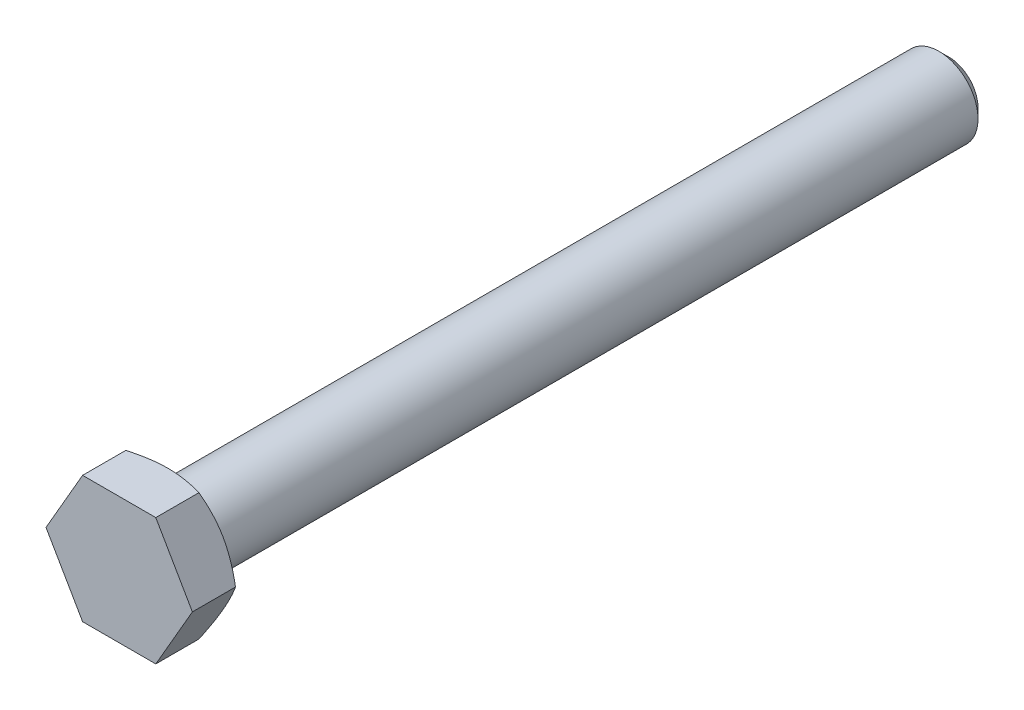
ISO-10303-21;
HEADER;
FILE_DESCRIPTION(('STEP AP214'),'2;1');
FILE_NAME('part.step','',(''),(''),'','','');
FILE_SCHEMA(('AUTOMOTIVE_DESIGN { 1 0 10303 214 1 1 1 1 }'));
ENDSEC;
DATA;
#1=APPLICATION_CONTEXT('core data for automotive mechanical design processes');
#2=APPLICATION_PROTOCOL_DEFINITION('international standard','automotive_design',2000,#1);
#3=PRODUCT_CONTEXT('',#1,'mechanical');
#4=PRODUCT('Part','Part','',(#3));
#5=PRODUCT_RELATED_PRODUCT_CATEGORY('part','',(#4));
#6=PRODUCT_DEFINITION_FORMATION('','',#4);
#7=PRODUCT_DEFINITION_CONTEXT('part definition',#1,'design');
#8=PRODUCT_DEFINITION('design','',#6,#7);
#9=PRODUCT_DEFINITION_SHAPE('','',#8);
#10=(LENGTH_UNIT() NAMED_UNIT(*) SI_UNIT(.MILLI.,.METRE.));
#11=(NAMED_UNIT(*) PLANE_ANGLE_UNIT() SI_UNIT($,.RADIAN.));
#12=(NAMED_UNIT(*) SI_UNIT($,.STERADIAN.) SOLID_ANGLE_UNIT());
#13=UNCERTAINTY_MEASURE_WITH_UNIT(LENGTH_MEASURE(1.E-05),#10,'distance_accuracy_value','');
#14=(GEOMETRIC_REPRESENTATION_CONTEXT(3) GLOBAL_UNCERTAINTY_ASSIGNED_CONTEXT((#13)) GLOBAL_UNIT_ASSIGNED_CONTEXT((#10,
#11,#12)) REPRESENTATION_CONTEXT('',''));
#15=CARTESIAN_POINT('',(0.,0.,0.));
#16=DIRECTION('',(0.,0.,1.));
#17=DIRECTION('',(1.,0.,0.));
#18=AXIS2_PLACEMENT_3D('',#15,#16,#17);
#19=CARTESIAN_POINT('',(7.5,0.,5.));
#20=DIRECTION('',(-0.866025403784439,-0.5,0.));
#21=DIRECTION('',(0.5,-0.866025403784439,0.));
#22=AXIS2_PLACEMENT_3D('',#19,#20,#21);
#23=PLANE('',#22);
#24=DIRECTION('',(0.,0.,-1.));
#25=VECTOR('',#24,1.);
#26=CARTESIAN_POINT('',(7.5,0.,5.));
#27=LINE('',#26,#25);
#28=CARTESIAN_POINT('',(7.5,0.,5.));
#29=VERTEX_POINT('',#28);
#30=CARTESIAN_POINT('',(7.5,0.,0.580127018922191));
#31=VERTEX_POINT('',#30);
#32=EDGE_CURVE('E143',#29,#31,#27,.T.);
#33=ORIENTED_EDGE('',*,*,#32,.T.);
#34=CARTESIAN_POINT('',(7.50011547005384,-0.000199999999999949,0.580193687128435));
#35=CARTESIAN_POINT('',(7.41768616603124,0.142571742599681,0.532610090419495));
#36=CARTESIAN_POINT('',(7.3349495256106,0.285875807455784,0.487186000875851));
#37=CARTESIAN_POINT('',(7.16880433369847,0.573647721280876,0.401251609567944));
#38=CARTESIAN_POINT('',(7.08539550877554,0.718116043847015,0.360743427545913));
#39=CARTESIAN_POINT('',(6.83383355035314,1.15383413708613,0.247387850758794));
#40=CARTESIAN_POINT('',(6.66468741472466,1.44680383789861,0.182912394052971));
#41=CARTESIAN_POINT('',(6.4115632992282,1.8852276665594,0.107307146727918));
#42=CARTESIAN_POINT('',(6.32834163062897,2.02937182486393,0.0857693653869544));
#43=CARTESIAN_POINT('',(6.16152225564995,2.31831145801448,0.0496535615876752));
#44=CARTESIAN_POINT('',(6.07792458315417,2.46310687417167,0.0350749241985891));
#45=CARTESIAN_POINT('',(5.91058404423487,2.75294918974585,0.0132489492577837));
#46=CARTESIAN_POINT('',(5.82684145112455,2.89799561577049,0.00599329148663797));
#47=CARTESIAN_POINT('',(5.65928352773976,3.18821445228368,-0.00103892731730185));
#48=CARTESIAN_POINT('',(5.57546819979228,3.33338685874177,-0.000815719394339566));
#49=CARTESIAN_POINT('',(5.34584085633415,3.73111308441831,0.0100759915864038));
#50=CARTESIAN_POINT('',(5.20010400598298,3.9835367137616,0.0283608108200575));
#51=CARTESIAN_POINT('',(4.90959827845889,4.4867073937231,0.0863424032005451));
#52=CARTESIAN_POINT('',(4.76483042296501,4.73745267474128,0.126058994528075));
#53=CARTESIAN_POINT('',(4.47374004278017,5.24163600281596,0.225339055162585));
#54=CARTESIAN_POINT('',(4.3274542486132,5.49501043073871,0.285323167972338));
#55=CARTESIAN_POINT('',(4.03706420721455,5.99798073645321,0.421462943609341));
#56=CARTESIAN_POINT('',(3.89295624098379,6.24758305574031,0.49758662732135));
#57=CARTESIAN_POINT('',(3.74988452994616,6.49539052838329,0.580193687128433));
#58=B_SPLINE_CURVE_WITH_KNOTS('',3,(#34,#35,#36,#37,#38,#39,#40,#41,#42,#43,#44,#45,#46,#47,#48,
#49,#50,#51,#52,#53,#54,#55,#56,#57),.UNSPECIFIED.,.F.,.F.,(4,2,2,2,2,2,2,2,2,2,2,4),(0.,
0.514723922375489,1.02966901127207,2.0616989527718,2.5650745724735,3.06840570416265,
3.57116431536224,4.07390739487819,4.9491290028208,5.82516132758661,6.72062300407034,
7.61432671345324),.UNSPECIFIED.);
#59=CARTESIAN_POINT('',(5.625,3.24759526419165,0.));
#60=VERTEX_POINT('',#59);
#61=EDGE_CURVE('E63',#31,#60,#58,.T.);
#62=ORIENTED_EDGE('',*,*,#61,.T.);
#63=CARTESIAN_POINT('',(3.75,6.49519052838329,0.58012701892219));
#64=VERTEX_POINT('',#63);
#65=EDGE_CURVE('E113',#60,#64,#58,.T.);
#66=ORIENTED_EDGE('',*,*,#65,.T.);
#67=DIRECTION('',(0.,0.,-1.));
#68=VECTOR('',#67,1.);
#69=CARTESIAN_POINT('',(3.75,6.49519052838329,5.));
#70=LINE('',#69,#68);
#71=CARTESIAN_POINT('',(3.75,6.49519052838329,5.));
#72=VERTEX_POINT('',#71);
#73=EDGE_CURVE('E133',#72,#64,#70,.T.);
#74=ORIENTED_EDGE('',*,*,#73,.F.);
#75=DIRECTION('',(-0.5,0.866025403784438,0.));
#76=VECTOR('',#75,1.);
#77=CARTESIAN_POINT('',(7.5,0.,5.));
#78=LINE('',#77,#76);
#79=EDGE_CURVE('E145',#29,#72,#78,.T.);
#80=ORIENTED_EDGE('',*,*,#79,.F.);
#81=EDGE_LOOP('',(#33,#62,#66,#74,#80));
#82=FACE_BOUND('',#81,.T.);
#83=ADVANCED_FACE('F40',(#82),#23,.F.);
#84=CARTESIAN_POINT('',(3.75,6.49519052838329,5.));
#85=DIRECTION('',(0.,-1.,0.));
#86=DIRECTION('',(1.,0.,0.));
#87=AXIS2_PLACEMENT_3D('',#84,#85,#86);
#88=PLANE('',#87);
#89=ORIENTED_EDGE('',*,*,#73,.T.);
#90=CARTESIAN_POINT('',(-10.2143177328781,6.49519052838329,3.23855699812648));
#91=CARTESIAN_POINT('',(-9.92937782566756,6.49519052838329,3.09977310338341));
#92=CARTESIAN_POINT('',(-9.64379873250614,6.49519052838329,2.96227977722785));
#93=CARTESIAN_POINT('',(-9.07102271991364,6.49519052838329,2.690597498021));
#94=CARTESIAN_POINT('',(-8.78382556611934,6.49519052838329,2.55640903960392));
#95=CARTESIAN_POINT('',(-8.20606136902504,6.49519052838329,2.29141476420042));
#96=CARTESIAN_POINT('',(-7.91548456955182,6.49519052838329,2.1606301474799));
#97=CARTESIAN_POINT('',(-7.3320683315702,6.49519052838329,1.90422854126504));
#98=CARTESIAN_POINT('',(-7.03922899676572,6.49519052838329,1.77861131657145));
#99=CARTESIAN_POINT('',(-6.44091658138017,6.49519052838329,1.52978473547082));
#100=CARTESIAN_POINT('',(-6.13535008160523,6.49519052838329,1.40679882379654));
#101=CARTESIAN_POINT('',(-5.52069463815076,6.49519052838329,1.1697974683184));
#102=CARTESIAN_POINT('',(-5.21160531141305,6.49519052838329,1.05578301089667));
#103=CARTESIAN_POINT('',(-4.58994750100513,6.49519052838329,0.839613687055503));
#104=CARTESIAN_POINT('',(-4.2773870280813,6.49519052838329,0.737436003614696));
#105=CARTESIAN_POINT('',(-3.64778139182068,6.49519052838329,0.548125910576095));
#106=CARTESIAN_POINT('',(-3.33073762878825,6.49519052838329,0.460988910786462));
#107=CARTESIAN_POINT('',(-2.69375106173017,6.49519052838329,0.306305297362037));
#108=CARTESIAN_POINT('',(-2.37383516188108,6.49519052838329,0.23864962450138));
#109=CARTESIAN_POINT('',(-1.72983594930496,6.49519052838329,0.126677587952621));
#110=CARTESIAN_POINT('',(-1.40575309003197,6.49519052838329,0.0823587063795372));
#111=CARTESIAN_POINT('',(-0.91995511736602,6.49519052838329,0.0363188001026214));
#112=CARTESIAN_POINT('',(-0.75916885761079,6.49519052838329,0.0243920037236542));
#113=CARTESIAN_POINT('',(-0.437228665901692,6.49519052838329,0.00734898653286887));
#114=CARTESIAN_POINT('',(-0.276074740321146,6.49519052838329,0.00223264854992558));
#115=CARTESIAN_POINT('',(0.0463045701559833,6.49519052838329,-0.00105953294185505));
#116=CARTESIAN_POINT('',(0.207529955475957,6.49519052838329,0.000764665235886284));
#117=CARTESIAN_POINT('',(0.529757571671926,6.49519052838329,0.0113054643754604));
#118=CARTESIAN_POINT('',(0.690759791916552,6.49519052838329,0.0200223831111962));
#119=CARTESIAN_POINT('',(1.07342716374101,6.49519052838329,0.0487447345134835));
#120=CARTESIAN_POINT('',(1.29486982068213,6.49519052838329,0.0717830174833733));
#121=CARTESIAN_POINT('',(1.73619336669356,6.49519052838329,0.129674507547541));
#122=CARTESIAN_POINT('',(1.95607405591142,6.49519052838329,0.164529199700948));
#123=CARTESIAN_POINT('',(2.61306950292882,6.49519052838329,0.28497639630774));
#124=CARTESIAN_POINT('',(3.04731889080792,6.49519052838329,0.386433355895114));
#125=CARTESIAN_POINT('',(3.69696959067752,6.49519052838329,0.56344508050541));
#126=CARTESIAN_POINT('',(3.9157089813365,6.49519052838329,0.627462380994136));
#127=CARTESIAN_POINT('',(4.3510654805509,6.49519052838329,0.762411258962937));
#128=CARTESIAN_POINT('',(4.56768257285683,6.49519052838329,0.833342889337522));
#129=CARTESIAN_POINT('',(4.99885995708295,6.49519052838329,0.980960376496011));
#130=CARTESIAN_POINT('',(5.21342081635982,6.49519052838329,1.05764459127043));
#131=CARTESIAN_POINT('',(5.64074490076441,6.49519052838329,1.21583846936278));
#132=CARTESIAN_POINT('',(5.8535081659978,6.49519052838329,1.29734802469715));
#133=CARTESIAN_POINT('',(6.42328241405909,6.49519052838329,1.52185854263229));
#134=CARTESIAN_POINT('',(6.77882469594556,6.49519052838329,1.66858322210534));
#135=CARTESIAN_POINT('',(7.48627297915079,6.49519052838329,1.97058209220521));
#136=CARTESIAN_POINT('',(7.83817858089586,6.49519052838329,2.12585721068029));
#137=CARTESIAN_POINT('',(8.53918217513453,6.49519052838329,2.44294479207036));
#138=CARTESIAN_POINT('',(8.88827905870496,6.49519052838329,2.60475969841126));
#139=CARTESIAN_POINT('',(9.58409510328724,6.49519052838329,2.93337165002427));
#140=CARTESIAN_POINT('',(9.9308143582495,6.49519052838329,3.10016849702719));
#141=CARTESIAN_POINT('',(10.6228921918611,6.49519052838329,3.43793266772857));
#142=CARTESIAN_POINT('',(10.9682477421369,6.49519052838329,3.60890618358546));
#143=CARTESIAN_POINT('',(11.6574027918699,6.49519052838329,3.95396275615297));
#144=CARTESIAN_POINT('',(12.0012022786522,6.49519052838329,4.12804583813564));
#145=CARTESIAN_POINT('',(12.6874470398161,6.49519052838329,4.47867537964061));
#146=CARTESIAN_POINT('',(13.0298925922875,6.49519052838329,4.65522129553832));
#147=CARTESIAN_POINT('',(13.7137239163398,6.49519052838329,5.01035495423973));
#148=CARTESIAN_POINT('',(14.0551096836652,6.49519052838329,5.18894270522896));
#149=CARTESIAN_POINT('',(15.0063746854987,6.49519052838329,5.68955351131712));
#150=CARTESIAN_POINT('',(15.6152823797386,6.49519052838329,6.01342230712951));
#151=CARTESIAN_POINT('',(16.8310464418336,6.49519052838329,6.66506668504544));
#152=CARTESIAN_POINT('',(17.4379026831499,6.49519052838329,6.99284250269669));
#153=CARTESIAN_POINT('',(18.6480223842144,6.49519052838329,7.65020748849126));
#154=CARTESIAN_POINT('',(19.2512910828378,6.49519052838329,7.97978702208852));
#155=CARTESIAN_POINT('',(20.4565453466247,6.49519052838329,8.64117394373983));
#156=CARTESIAN_POINT('',(21.0585310081091,6.49519052838329,8.97298115619473));
#157=CARTESIAN_POINT('',(21.6600655330145,6.49519052838329,9.30559827423314));
#158=B_SPLINE_CURVE_WITH_KNOTS('',3,(#90,#91,#92,#93,#94,#95,#96,#97,#98,#99,#100,#101,#102,
#103,#104,#105,#106,#107,#108,#109,#110,#111,#112,#113,#114,#115,#116,#117,#118,#119,#120,#121,
#122,#123,#124,#125,#126,#127,#128,#129,#130,#131,#132,#133,#134,#135,#136,#137,#138,#139,#140,
#141,#142,#143,#144,#145,#146,#147,#148,#149,#150,#151,#152,#153,#154,#155,#156,#157),
.UNSPECIFIED.,.F.,.F.,(4,2,2,2,2,2,2,2,2,2,2,2,2,2,2,2,2,2,2,2,2,2,2,2,2,2,2,2,2,2,2,2,2,4),(0.,
0.950834542495559,1.90181054052274,2.85772804576964,3.81360199317826,4.80165700273162,
5.78982049436006,6.77604630055793,7.76197059117202,8.74226317862624,9.72244997732981,
10.2060117065476,10.689565116178,11.1731214301544,11.6567000387438,12.3242396356646,
12.9918631585464,14.327765856812,15.011449063204,15.6951375001718,16.3786315232496,
17.0621102565818,18.2158265722199,19.3696683306914,20.5239452521552,21.6781762972382,
22.8342371104341,23.9903073234391,25.1461262711256,26.3019498540068,28.3709701510111,
30.4401158230678,32.5023912333311,34.5645059477712),.UNSPECIFIED.);
#159=CARTESIAN_POINT('',(0.,6.49519052838329,0.));
#160=VERTEX_POINT('',#159);
#161=EDGE_CURVE('E119',#64,#160,#158,.F.);
#162=ORIENTED_EDGE('',*,*,#161,.T.);
#163=CARTESIAN_POINT('',(-3.75,6.49519052838329,0.580127018922189));
#164=VERTEX_POINT('',#163);
#165=EDGE_CURVE('E157',#160,#164,#158,.F.);
#166=ORIENTED_EDGE('',*,*,#165,.T.);
#167=DIRECTION('',(0.,0.,-1.));
#168=VECTOR('',#167,1.);
#169=CARTESIAN_POINT('',(-3.75,6.49519052838329,5.));
#170=LINE('',#169,#168);
#171=CARTESIAN_POINT('',(-3.75,6.49519052838329,5.));
#172=VERTEX_POINT('',#171);
#173=EDGE_CURVE('E226',#172,#164,#170,.T.);
#174=ORIENTED_EDGE('',*,*,#173,.F.);
#175=DIRECTION('',(-1.,0.,0.));
#176=VECTOR('',#175,1.);
#177=CARTESIAN_POINT('',(3.75,6.49519052838329,5.));
#178=LINE('',#177,#176);
#179=EDGE_CURVE('E148',#72,#172,#178,.T.);
#180=ORIENTED_EDGE('',*,*,#179,.F.);
#181=EDGE_LOOP('',(#89,#162,#166,#174,#180));
#182=FACE_BOUND('',#181,.T.);
#183=ADVANCED_FACE('F214',(#182),#88,.F.);
#184=CARTESIAN_POINT('',(-3.75,6.49519052838329,5.));
#185=DIRECTION('',(0.866025403784439,-0.5,0.));
#186=DIRECTION('',(0.5,0.866025403784439,0.));
#187=AXIS2_PLACEMENT_3D('',#184,#185,#186);
#188=PLANE('',#187);
#189=ORIENTED_EDGE('',*,*,#173,.T.);
#190=CARTESIAN_POINT('',(-3.74988452994616,6.49539052838329,0.580193687128433));
#191=CARTESIAN_POINT('',(-3.83231383396876,6.35261878578361,0.532610090419493));
#192=CARTESIAN_POINT('',(-3.9150504743894,6.20931472092751,0.487186000875849));
#193=CARTESIAN_POINT('',(-4.08119566630153,5.92154280710242,0.401251609567942));
#194=CARTESIAN_POINT('',(-4.16460449122446,5.77707448453628,0.360743427545912));
#195=CARTESIAN_POINT('',(-4.41616644964686,5.34135639129716,0.247387850758792));
#196=CARTESIAN_POINT('',(-4.58531258527534,5.04838669048468,0.18291239405297));
#197=CARTESIAN_POINT('',(-4.8384367007718,4.60996286182389,0.107307146727917));
#198=CARTESIAN_POINT('',(-4.92165836937103,4.46581870351936,0.0857693653869528));
#199=CARTESIAN_POINT('',(-5.08847774435005,4.17687907036881,0.0496535615876734));
#200=CARTESIAN_POINT('',(-5.17207541684583,4.03208365421162,0.0350749241985873));
#201=CARTESIAN_POINT('',(-5.33941595576513,3.74224133863744,0.013248949257782));
#202=CARTESIAN_POINT('',(-5.42315854887545,3.5971949126128,0.00599329148663643));
#203=CARTESIAN_POINT('',(-5.59071647226023,3.30697607609961,-0.00103892731730333));
#204=CARTESIAN_POINT('',(-5.67453180020772,3.16180366964152,-0.000815719394341106));
#205=CARTESIAN_POINT('',(-5.90415914366584,2.76407744396498,0.010075991586402));
#206=CARTESIAN_POINT('',(-6.04989599401702,2.51165381462169,0.0283608108200555));
#207=CARTESIAN_POINT('',(-6.34040172154111,2.00848313466019,0.0863424032005432));
#208=CARTESIAN_POINT('',(-6.48516957703499,1.75773785364201,0.126058994528074));
#209=CARTESIAN_POINT('',(-6.77625995721982,1.25355452556733,0.225339055162583));
#210=CARTESIAN_POINT('',(-6.92254575138679,1.00018009764458,0.285323167972336));
#211=CARTESIAN_POINT('',(-7.21293579278545,0.497209791930077,0.421462943609339));
#212=CARTESIAN_POINT('',(-7.35704375901621,0.247607472642983,0.497586627321348));
#213=CARTESIAN_POINT('',(-7.50011547005384,-0.00020000000000036,0.580193687128432));
#214=B_SPLINE_CURVE_WITH_KNOTS('',3,(#190,#191,#192,#193,#194,#195,#196,#197,#198,#199,#200,
#201,#202,#203,#204,#205,#206,#207,#208,#209,#210,#211,#212,#213),.UNSPECIFIED.,.F.,.F.,(4,2,2,
2,2,2,2,2,2,2,2,4),(0.,0.514723922375488,1.02966901127207,2.0616989527718,2.5650745724735,
3.06840570416265,3.57116431536224,4.07390739487819,4.94912900282079,5.82516132758661,
6.72062300407034,7.61432671345324),.UNSPECIFIED.);
#215=CARTESIAN_POINT('',(-5.625,3.24759526419164,0.));
#216=VERTEX_POINT('',#215);
#217=EDGE_CURVE('E208',#164,#216,#214,.T.);
#218=ORIENTED_EDGE('',*,*,#217,.T.);
#219=CARTESIAN_POINT('',(-7.5,0.,0.580127018922188));
#220=VERTEX_POINT('',#219);
#221=EDGE_CURVE('E200',#216,#220,#214,.T.);
#222=ORIENTED_EDGE('',*,*,#221,.T.);
#223=DIRECTION('',(0.,0.,-1.));
#224=VECTOR('',#223,1.);
#225=CARTESIAN_POINT('',(-7.5,0.,5.));
#226=LINE('',#225,#224);
#227=CARTESIAN_POINT('',(-7.5,0.,5.));
#228=VERTEX_POINT('',#227);
#229=EDGE_CURVE('E230',#228,#220,#226,.T.);
#230=ORIENTED_EDGE('',*,*,#229,.F.);
#231=DIRECTION('',(-0.5,-0.866025403784439,0.));
#232=VECTOR('',#231,1.);
#233=CARTESIAN_POINT('',(-3.75,6.49519052838329,5.));
#234=LINE('',#233,#232);
#235=EDGE_CURVE('E311',#172,#228,#234,.T.);
#236=ORIENTED_EDGE('',*,*,#235,.F.);
#237=EDGE_LOOP('',(#189,#218,#222,#230,#236));
#238=FACE_BOUND('',#237,.T.);
#239=ADVANCED_FACE('F210',(#238),#188,.F.);
#240=CARTESIAN_POINT('',(-7.5,0.,5.));
#241=DIRECTION('',(0.866025403784438,0.5,0.));
#242=DIRECTION('',(-0.5,0.866025403784439,0.));
#243=AXIS2_PLACEMENT_3D('',#240,#241,#242);
#244=PLANE('',#243);
#245=ORIENTED_EDGE('',*,*,#229,.T.);
#246=CARTESIAN_POINT('',(-7.50011547005384,0.000199999999999202,0.580193687128432));
#247=CARTESIAN_POINT('',(-7.41768616603124,-0.142571742599681,0.532610090419491));
#248=CARTESIAN_POINT('',(-7.3349495256106,-0.285875807455784,0.487186000875848));
#249=CARTESIAN_POINT('',(-7.16880433369847,-0.573647721280876,0.401251609567941));
#250=CARTESIAN_POINT('',(-7.08539550877553,-0.718116043847015,0.36074342754591));
#251=CARTESIAN_POINT('',(-6.83383355035314,-1.15383413708614,0.247387850758791));
#252=CARTESIAN_POINT('',(-6.66468741472465,-1.44680383789861,0.182912394052967));
#253=CARTESIAN_POINT('',(-6.4115632992282,-1.8852276665594,0.107307146727916));
#254=CARTESIAN_POINT('',(-6.32834163062897,-2.02937182486393,0.0857693653869522));
#255=CARTESIAN_POINT('',(-6.16152225564994,-2.31831145801448,0.0496535615876731));
#256=CARTESIAN_POINT('',(-6.07792458315417,-2.46310687417167,0.0350749241985866));
#257=CARTESIAN_POINT('',(-5.91058404423487,-2.75294918974585,0.013248949257781));
#258=CARTESIAN_POINT('',(-5.82684145112455,-2.89799561577049,0.0059932914866354));
#259=CARTESIAN_POINT('',(-5.65928352773976,-3.18821445228368,-0.0010389273173043));
#260=CARTESIAN_POINT('',(-5.57546819979228,-3.33338685874177,-0.000815719394342058));
#261=CARTESIAN_POINT('',(-5.34584085633415,-3.73111308441831,0.0100759915864013));
#262=CARTESIAN_POINT('',(-5.20010400598298,-3.9835367137616,0.0283608108200551));
#263=CARTESIAN_POINT('',(-4.90959827845888,-4.4867073937231,0.0863424032005431));
#264=CARTESIAN_POINT('',(-4.764830422965,-4.73745267474128,0.126058994528074));
#265=CARTESIAN_POINT('',(-4.47374004278017,-5.24163600281596,0.225339055162583));
#266=CARTESIAN_POINT('',(-4.3274542486132,-5.49501043073871,0.285323167972336));
#267=CARTESIAN_POINT('',(-4.03706420721454,-5.99798073645321,0.42146294360934));
#268=CARTESIAN_POINT('',(-3.89295624098378,-6.24758305574031,0.497586627321349));
#269=CARTESIAN_POINT('',(-3.74988452994616,-6.49539052838329,0.580193687128433));
#270=B_SPLINE_CURVE_WITH_KNOTS('',3,(#246,#247,#248,#249,#250,#251,#252,#253,#254,#255,#256,
#257,#258,#259,#260,#261,#262,#263,#264,#265,#266,#267,#268,#269),.UNSPECIFIED.,.F.,.F.,(4,2,2,
2,2,2,2,2,2,2,2,4),(0.,0.514723922375489,1.02966901127207,2.0616989527718,2.5650745724735,
3.06840570416264,3.57116431536223,4.07390739487819,4.94912900282079,5.82516132758661,
6.72062300407034,7.61432671345324),.UNSPECIFIED.);
#271=CARTESIAN_POINT('',(-5.625,-3.24759526419165,0.));
#272=VERTEX_POINT('',#271);
#273=EDGE_CURVE('E209',#220,#272,#270,.T.);
#274=ORIENTED_EDGE('',*,*,#273,.T.);
#275=CARTESIAN_POINT('',(-3.75000000000033,-6.49519052838329,0.580127018921965));
#276=VERTEX_POINT('',#275);
#277=EDGE_CURVE('E194',#272,#276,#270,.T.);
#278=ORIENTED_EDGE('',*,*,#277,.T.);
#279=DIRECTION('',(0.,0.,-1.));
#280=VECTOR('',#279,1.);
#281=CARTESIAN_POINT('',(-3.74999999999999,-6.49519052838329,5.));
#282=LINE('',#281,#280);
#283=CARTESIAN_POINT('',(-3.74999999999999,-6.49519052838329,5.));
#284=VERTEX_POINT('',#283);
#285=EDGE_CURVE('E285',#284,#276,#282,.T.);
#286=ORIENTED_EDGE('',*,*,#285,.F.);
#287=DIRECTION('',(0.5,-0.866025403784439,0.));
#288=VECTOR('',#287,1.);
#289=CARTESIAN_POINT('',(-7.5,0.,5.));
#290=LINE('',#289,#288);
#291=EDGE_CURVE('E308',#228,#284,#290,.T.);
#292=ORIENTED_EDGE('',*,*,#291,.F.);
#293=EDGE_LOOP('',(#245,#274,#278,#286,#292));
#294=FACE_BOUND('',#293,.T.);
#295=ADVANCED_FACE('F213',(#294),#244,.F.);
#296=CARTESIAN_POINT('',(-3.74999999999999,-6.49519052838329,5.));
#297=DIRECTION('',(0.,1.,0.));
#298=DIRECTION('',(0.,0.,1.));
#299=AXIS2_PLACEMENT_3D('',#296,#297,#298);
#300=PLANE('',#299);
#301=ORIENTED_EDGE('',*,*,#285,.T.);
#302=CARTESIAN_POINT('',(-10.2143177277712,-6.49519052838329,3.23855699563843));
#303=CARTESIAN_POINT('',(-9.92937782073258,-6.49519052838329,3.09977310099907));
#304=CARTESIAN_POINT('',(-9.64379872774321,-6.49519052838329,2.96227977494717));
#305=CARTESIAN_POINT('',(-9.07102271549534,-6.49519052838329,2.69059749594712));
#306=CARTESIAN_POINT('',(-8.78382556187362,-6.49519052838329,2.5564090376332));
#307=CARTESIAN_POINT('',(-8.20606136512707,-6.49519052838329,2.29141476243606));
#308=CARTESIAN_POINT('',(-7.91548456582904,-6.49519052838329,2.16063014581873));
#309=CARTESIAN_POINT('',(-7.33206832819897,-6.49519052838329,1.90422853980855));
#310=CARTESIAN_POINT('',(-7.03922899357086,-6.49519052838329,1.77861131521644));
#311=CARTESIAN_POINT('',(-6.44091657855193,-6.49519052838329,1.52978473432185));
#312=CARTESIAN_POINT('',(-6.13535007896736,-6.49519052838329,1.40679882275188));
#313=CARTESIAN_POINT('',(-5.52069463589667,-6.49519052838329,1.16979746747682));
#314=CARTESIAN_POINT('',(-5.21160530935238,-6.49519052838329,1.05578301015387));
#315=CARTESIAN_POINT('',(-4.58994749933485,-6.49519052838329,0.839613686500893));
#316=CARTESIAN_POINT('',(-4.277387026608,-6.49519052838329,0.737436003149523));
#317=CARTESIAN_POINT('',(-3.64778139074667,-6.49519052838329,0.548125910275322));
#318=CARTESIAN_POINT('',(-3.33073762791656,-6.49519052838329,0.460988910560662));
#319=CARTESIAN_POINT('',(-2.69375106136614,-6.49519052838329,0.306305297287673));
#320=CARTESIAN_POINT('',(-2.3738351618238,-6.49519052838329,0.238649624497777));
#321=CARTESIAN_POINT('',(-1.7298359498688,-6.49519052838329,0.126677588044324));
#322=CARTESIAN_POINT('',(-1.40575309091018,-6.49519052838329,0.0823587064958193));
#323=CARTESIAN_POINT('',(-0.919955118713613,-6.49519052838329,0.03631880021397));
#324=CARTESIAN_POINT('',(-0.759168859112559,-6.49519052838329,0.0243920038265745));
#325=CARTESIAN_POINT('',(-0.437228667711566,-6.49519052838329,0.00734898660529976));
#326=CARTESIAN_POINT('',(-0.276074742284951,-6.49519052838329,0.0022326486002957));
#327=CARTESIAN_POINT('',(0.0463045678854481,-6.49519052838329,-0.00105953294898837));
#328=CARTESIAN_POINT('',(0.207529953052621,-6.49519052838329,0.000764665193308014));
#329=CARTESIAN_POINT('',(0.52975756894496,-6.49519052838329,0.0113054642495449));
#330=CARTESIAN_POINT('',(0.690759789038755,-6.49519052838329,0.020022382937387));
#331=CARTESIAN_POINT('',(1.07342716063168,-6.49519052838329,0.0487447342219338));
#332=CARTESIAN_POINT('',(1.29486981749273,-6.49519052838329,0.0717830171241595));
#333=CARTESIAN_POINT('',(1.73619336334772,-6.49519052838329,0.1296745070494));
#334=CARTESIAN_POINT('',(1.95607405248919,-6.49519052838329,0.164529199131544));
#335=CARTESIAN_POINT('',(2.61306949928163,-6.49519052838329,0.284976395523082));
#336=CARTESIAN_POINT('',(3.04731888701673,-6.49519052838329,0.386433354965096));
#337=CARTESIAN_POINT('',(3.69696958667096,-6.49519052838329,0.56344507936097));
#338=CARTESIAN_POINT('',(3.91570897725659,-6.49519052838329,0.627462379777731));
#339=CARTESIAN_POINT('',(4.35106547632513,-6.49519052838329,0.762411257604838));
#340=CARTESIAN_POINT('',(4.56768256855855,-6.49519052838329,0.833342887909693));
#341=CARTESIAN_POINT('',(4.9988599526402,-6.49519052838329,0.980960374931258));
#342=CARTESIAN_POINT('',(5.2134208118451,-6.49519052838329,1.05764458963849));
#343=CARTESIAN_POINT('',(5.64074489610576,-6.49519052838329,1.21583846759883));
#344=CARTESIAN_POINT('',(5.85350816126718,-6.49519052838329,1.29734802286838));
#345=CARTESIAN_POINT('',(6.4232824092875,-6.49519052838329,1.5218585406924));
#346=CARTESIAN_POINT('',(6.77882469120287,-6.49519052838329,1.66858322012606));
#347=CARTESIAN_POINT('',(7.48627297446219,-6.49519052838329,1.97058209015851));
#348=CARTESIAN_POINT('',(7.83817857623244,-6.49519052838329,2.12585720860556));
#349=CARTESIAN_POINT('',(8.5391821705188,-6.49519052838329,2.44294478994782));
#350=CARTESIAN_POINT('',(8.88827905411172,-6.49519052838329,2.60475969626894));
#351=CARTESIAN_POINT('',(9.58409509873656,-6.49519052838329,2.93337164784823));
#352=CARTESIAN_POINT('',(9.93081435371888,-6.49519052838329,3.10016849483721));
#353=CARTESIAN_POINT('',(10.62289218737,-6.49519052838329,3.43793266551556));
#354=CARTESIAN_POINT('',(10.9682477376653,-6.49519052838329,3.60890618136338));
#355=CARTESIAN_POINT('',(11.6574027874357,-6.49519052838329,3.95396275391597));
#356=CARTESIAN_POINT('',(12.001202274236,-6.49519052838329,4.12804583589279));
#357=CARTESIAN_POINT('',(12.6874470354346,-6.49519052838329,4.47867537738838));
#358=CARTESIAN_POINT('',(13.0298925879227,-6.49519052838329,4.65522129328255));
#359=CARTESIAN_POINT('',(13.7137239120074,-6.49519052838329,5.01035495197875));
#360=CARTESIAN_POINT('',(14.0551096793485,-6.49519052838329,5.18894270296631));
#361=CARTESIAN_POINT('',(15.0063746811986,-6.49519052838329,5.68955350903789));
#362=CARTESIAN_POINT('',(15.6152823754387,-6.49519052838329,6.01342230483674));
#363=CARTESIAN_POINT('',(16.8310464375328,-6.49519052838329,6.66506668272832));
#364=CARTESIAN_POINT('',(17.437902678848,-6.49519052838329,6.99284250036878));
#365=CARTESIAN_POINT('',(18.6480223799049,-6.49519052838329,7.65020748614121));
#366=CARTESIAN_POINT('',(19.2512910785217,-6.49519052838329,7.97978701972709));
#367=CARTESIAN_POINT('',(20.4565453422947,-6.49519052838329,8.64117394135688));
#368=CARTESIAN_POINT('',(21.0585310037718,-6.49519052838329,8.97298115380166));
#369=CARTESIAN_POINT('',(21.6600655286696,-6.49519052838329,9.30559827183035));
#370=B_SPLINE_CURVE_WITH_KNOTS('',3,(#302,#303,#304,#305,#306,#307,#308,#309,#310,#311,#312,
#313,#314,#315,#316,#317,#318,#319,#320,#321,#322,#323,#324,#325,#326,#327,#328,#329,#330,#331,
#332,#333,#334,#335,#336,#337,#338,#339,#340,#341,#342,#343,#344,#345,#346,#347,#348,#349,#350,
#351,#352,#353,#354,#355,#356,#357,#358,#359,#360,#361,#362,#363,#364,#365,#366,#367,#368,#369),
.UNSPECIFIED.,.F.,.F.,(4,2,2,2,2,2,2,2,2,2,2,2,2,2,2,2,2,2,2,2,2,2,2,2,2,2,2,2,2,2,2,2,2,4),(0.,
0.950834541895593,1.90181053932272,2.85772804396331,3.81360199076566,4.80165699967243,
5.78982049065406,6.77604629620722,7.7619705861771,8.74226317268899,9.72244997045161,
10.2060116992104,10.6895651083818,11.173121421899,11.6567000300292,12.3242396266903,
12.9918631493123,14.3277658470573,15.0114490531773,15.6951374898732,16.3786315126798,
17.0621102457407,18.2158265614134,19.3696683199199,20.5239452414199,21.6781762865389,
22.834237099775,23.9903073128203,25.1461262605463,26.3019498434671,28.3709701404527,
30.4401158124911,32.5023912227209,34.564505937127),.UNSPECIFIED.);
#371=CARTESIAN_POINT('',(0.,-6.49519052838329,0.));
#372=VERTEX_POINT('',#371);
#373=EDGE_CURVE('E287',#276,#372,#370,.T.);
#374=ORIENTED_EDGE('',*,*,#373,.T.);
#375=CARTESIAN_POINT('',(3.75,-6.49519052838329,0.580127018922191));
#376=VERTEX_POINT('',#375);
#377=EDGE_CURVE('E187',#372,#376,#370,.T.);
#378=ORIENTED_EDGE('',*,*,#377,.T.);
#379=DIRECTION('',(0.,0.,-1.));
#380=VECTOR('',#379,1.);
#381=CARTESIAN_POINT('',(3.75,-6.49519052838329,5.));
#382=LINE('',#381,#380);
#383=CARTESIAN_POINT('',(3.75,-6.49519052838329,5.));
#384=VERTEX_POINT('',#383);
#385=EDGE_CURVE('E293',#384,#376,#382,.T.);
#386=ORIENTED_EDGE('',*,*,#385,.F.);
#387=DIRECTION('',(1.,0.,0.));
#388=VECTOR('',#387,1.);
#389=CARTESIAN_POINT('',(-3.74999999999999,-6.49519052838329,5.));
#390=LINE('',#389,#388);
#391=EDGE_CURVE('E289',#284,#384,#390,.T.);
#392=ORIENTED_EDGE('',*,*,#391,.F.);
#393=EDGE_LOOP('',(#301,#374,#378,#386,#392));
#394=FACE_BOUND('',#393,.T.);
#395=ADVANCED_FACE('F272',(#394),#300,.F.);
#396=CARTESIAN_POINT('',(3.75,-6.49519052838329,5.));
#397=DIRECTION('',(-0.866025403784439,0.5,0.));
#398=DIRECTION('',(-0.5,-0.866025403784439,0.));
#399=AXIS2_PLACEMENT_3D('',#396,#397,#398);
#400=PLANE('',#399);
#401=ORIENTED_EDGE('',*,*,#385,.T.);
#402=CARTESIAN_POINT('',(3.74988452994616,-6.49539052838329,0.580193687128435));
#403=CARTESIAN_POINT('',(3.83231383396876,-6.35261878578361,0.532610090419494));
#404=CARTESIAN_POINT('',(3.9150504743894,-6.20931472092751,0.487186000875851));
#405=CARTESIAN_POINT('',(4.08119566630153,-5.92154280710242,0.401251609567944));
#406=CARTESIAN_POINT('',(4.16460449122446,-5.77707448453628,0.360743427545913));
#407=CARTESIAN_POINT('',(4.41616644964686,-5.34135639129716,0.247387850758794));
#408=CARTESIAN_POINT('',(4.58531258527535,-5.04838669048468,0.182912394052971));
#409=CARTESIAN_POINT('',(4.8384367007718,-4.60996286182389,0.107307146727919));
#410=CARTESIAN_POINT('',(4.92165836937103,-4.46581870351936,0.0857693653869549));
#411=CARTESIAN_POINT('',(5.08847774435006,-4.17687907036881,0.0496535615876757));
#412=CARTESIAN_POINT('',(5.17207541684583,-4.03208365421162,0.0350749241985895));
#413=CARTESIAN_POINT('',(5.33941595576513,-3.74224133863744,0.0132489492577841));
#414=CARTESIAN_POINT('',(5.42315854887545,-3.5971949126128,0.00599329148663832));
#415=CARTESIAN_POINT('',(5.59071647226024,-3.30697607609961,-0.00103892731730146));
#416=CARTESIAN_POINT('',(5.67453180020772,-3.16180366964152,-0.000815719394339107));
#417=CARTESIAN_POINT('',(5.90415914366585,-2.76407744396498,0.0100759915864044));
#418=CARTESIAN_POINT('',(6.04989599401702,-2.51165381462169,0.028360810820058));
#419=CARTESIAN_POINT('',(6.34040172154112,-2.00848313466019,0.0863424032005461));
#420=CARTESIAN_POINT('',(6.48516957703499,-1.75773785364201,0.126058994528077));
#421=CARTESIAN_POINT('',(6.77625995721983,-1.25355452556733,0.225339055162586));
#422=CARTESIAN_POINT('',(6.9225457513868,-1.00018009764458,0.285323167972339));
#423=CARTESIAN_POINT('',(7.21293579278545,-0.497209791930077,0.421462943609342));
#424=CARTESIAN_POINT('',(7.35704375901621,-0.247607472642982,0.497586627321351));
#425=CARTESIAN_POINT('',(7.50011547005384,0.000200000000000245,0.580193687128435));
#426=B_SPLINE_CURVE_WITH_KNOTS('',3,(#402,#403,#404,#405,#406,#407,#408,#409,#410,#411,#412,
#413,#414,#415,#416,#417,#418,#419,#420,#421,#422,#423,#424,#425),.UNSPECIFIED.,.F.,.F.,(4,2,2,
2,2,2,2,2,2,2,2,4),(0.,0.514723922375489,1.02966901127207,2.0616989527718,2.5650745724735,
3.06840570416265,3.57116431536224,4.07390739487819,4.9491290028208,5.82516132758661,
6.72062300407034,7.61432671345324),.UNSPECIFIED.);
#427=CARTESIAN_POINT('',(5.625,-3.24759526419165,0.));
#428=VERTEX_POINT('',#427);
#429=EDGE_CURVE('E320',#376,#428,#426,.T.);
#430=ORIENTED_EDGE('',*,*,#429,.T.);
#431=EDGE_CURVE('E128',#428,#31,#426,.T.);
#432=ORIENTED_EDGE('',*,*,#431,.T.);
#433=ORIENTED_EDGE('',*,*,#32,.F.);
#434=DIRECTION('',(0.5,0.866025403784439,0.));
#435=VECTOR('',#434,1.);
#436=CARTESIAN_POINT('',(3.75,-6.49519052838329,5.));
#437=LINE('',#436,#435);
#438=EDGE_CURVE('E303',#384,#29,#437,.T.);
#439=ORIENTED_EDGE('',*,*,#438,.F.);
#440=EDGE_LOOP('',(#401,#430,#432,#433,#439));
#441=FACE_BOUND('',#440,.T.);
#442=ADVANCED_FACE('F269',(#441),#400,.F.);
#443=CARTESIAN_POINT('',(0.,0.,5.));
#444=DIRECTION('',(0.,0.,1.));
#445=DIRECTION('',(1.,0.,0.));
#446=AXIS2_PLACEMENT_3D('',#443,#444,#445);
#447=PLANE('',#446);
#448=ORIENTED_EDGE('',*,*,#79,.T.);
#449=ORIENTED_EDGE('',*,*,#179,.T.);
#450=ORIENTED_EDGE('',*,*,#235,.T.);
#451=ORIENTED_EDGE('',*,*,#291,.T.);
#452=ORIENTED_EDGE('',*,*,#391,.T.);
#453=ORIENTED_EDGE('',*,*,#438,.T.);
#454=EDGE_LOOP('',(#448,#449,#450,#451,#452,#453));
#455=FACE_BOUND('',#454,.T.);
#456=ADVANCED_FACE('F170',(#455),#447,.T.);
#457=CARTESIAN_POINT('',(0.,0.,0.));
#458=DIRECTION('',(0.,0.,1.));
#459=DIRECTION('',(1.,0.,0.));
#460=AXIS2_PLACEMENT_3D('',#457,#458,#459);
#461=CONICAL_SURFACE('',#460,6.49519052838329,1.0471975511966);
#462=ORIENTED_EDGE('',*,*,#431,.F.);
#463=CARTESIAN_POINT('',(0.,0.,0.));
#464=DIRECTION('',(0.,0.,1.));
#465=DIRECTION('',(1.,0.,0.));
#466=AXIS2_PLACEMENT_3D('',#463,#464,#465);
#467=CIRCLE('',#466,6.49519052838329);
#468=EDGE_CURVE('E126',#60,#428,#467,.F.);
#469=ORIENTED_EDGE('',*,*,#468,.F.);
#470=ORIENTED_EDGE('',*,*,#61,.F.);
#471=EDGE_LOOP('',(#462,#469,#470));
#472=FACE_BOUND('',#471,.T.);
#473=ADVANCED_FACE('F127',(#472),#461,.T.);
#474=CARTESIAN_POINT('',(0.,0.,0.));
#475=DIRECTION('',(0.,0.,1.));
#476=DIRECTION('',(1.,0.,0.));
#477=AXIS2_PLACEMENT_3D('',#474,#475,#476);
#478=CIRCLE('',#477,6.49519052838329);
#479=EDGE_CURVE('E116',#60,#160,#478,.T.);
#480=ORIENTED_EDGE('',*,*,#479,.T.);
#481=ORIENTED_EDGE('',*,*,#161,.F.);
#482=ORIENTED_EDGE('',*,*,#65,.F.);
#483=EDGE_LOOP('',(#480,#481,#482));
#484=FACE_BOUND('',#483,.T.);
#485=ADVANCED_FACE('F114',(#484),#461,.T.);
#486=EDGE_CURVE('E132',#216,#160,#467,.F.);
#487=ORIENTED_EDGE('',*,*,#486,.F.);
#488=ORIENTED_EDGE('',*,*,#217,.F.);
#489=ORIENTED_EDGE('',*,*,#165,.F.);
#490=EDGE_LOOP('',(#487,#488,#489));
#491=FACE_BOUND('',#490,.T.);
#492=ADVANCED_FACE('F343',(#491),#461,.T.);
#493=EDGE_CURVE('E330',#272,#216,#467,.F.);
#494=ORIENTED_EDGE('',*,*,#493,.F.);
#495=ORIENTED_EDGE('',*,*,#273,.F.);
#496=ORIENTED_EDGE('',*,*,#221,.F.);
#497=EDGE_LOOP('',(#494,#495,#496));
#498=FACE_BOUND('',#497,.T.);
#499=ADVANCED_FACE('F329',(#498),#461,.T.);
#500=EDGE_CURVE('E333',#372,#272,#467,.F.);
#501=ORIENTED_EDGE('',*,*,#500,.F.);
#502=ORIENTED_EDGE('',*,*,#373,.F.);
#503=ORIENTED_EDGE('',*,*,#277,.F.);
#504=EDGE_LOOP('',(#501,#502,#503));
#505=FACE_BOUND('',#504,.T.);
#506=ADVANCED_FACE('F268',(#505),#461,.T.);
#507=EDGE_CURVE('E56',#428,#372,#467,.F.);
#508=ORIENTED_EDGE('',*,*,#507,.F.);
#509=ORIENTED_EDGE('',*,*,#429,.F.);
#510=ORIENTED_EDGE('',*,*,#377,.F.);
#511=EDGE_LOOP('',(#508,#509,#510));
#512=FACE_BOUND('',#511,.T.);
#513=ADVANCED_FACE('F171',(#512),#461,.T.);
#514=CARTESIAN_POINT('',(0.,0.,0.));
#515=DIRECTION('',(0.,0.,1.));
#516=DIRECTION('',(1.,0.,0.));
#517=AXIS2_PLACEMENT_3D('',#514,#515,#516);
#518=PLANE('',#517);
#519=CARTESIAN_POINT('',(0.,0.,0.));
#520=DIRECTION('',(0.,0.,1.));
#521=DIRECTION('',(1.,0.,0.));
#522=AXIS2_PLACEMENT_3D('',#519,#520,#521);
#523=CIRCLE('',#522,5.);
#524=CARTESIAN_POINT('',(5.,0.,0.));
#525=VERTEX_POINT('',#524);
#526=EDGE_CURVE('E234',#525,#525,#523,.T.);
#527=ORIENTED_EDGE('',*,*,#526,.T.);
#528=EDGE_LOOP('',(#527));
#529=FACE_BOUND('',#528,.T.);
#530=ORIENTED_EDGE('',*,*,#468,.T.);
#531=ORIENTED_EDGE('',*,*,#507,.T.);
#532=ORIENTED_EDGE('',*,*,#500,.T.);
#533=ORIENTED_EDGE('',*,*,#493,.T.);
#534=ORIENTED_EDGE('',*,*,#486,.T.);
#535=ORIENTED_EDGE('',*,*,#479,.F.);
#536=EDGE_LOOP('',(#530,#531,#532,#533,#534,#535));
#537=FACE_BOUND('',#536,.T.);
#538=ADVANCED_FACE('F135',(#529,#537),#518,.F.);
#539=CARTESIAN_POINT('',(0.,0.,-80.));
#540=DIRECTION('',(0.,0.,1.));
#541=DIRECTION('',(1.,0.,0.));
#542=AXIS2_PLACEMENT_3D('',#539,#540,#541);
#543=CYLINDRICAL_SURFACE('',#542,4.);
#544=CARTESIAN_POINT('',(0.,0.,-79.));
#545=DIRECTION('',(0.,0.,1.));
#546=DIRECTION('',(1.,0.,0.));
#547=AXIS2_PLACEMENT_3D('',#544,#545,#546);
#548=CIRCLE('',#547,4.);
#549=CARTESIAN_POINT('',(4.,0.,-79.));
#550=VERTEX_POINT('',#549);
#551=EDGE_CURVE('E49',#550,#550,#548,.T.);
#552=ORIENTED_EDGE('',*,*,#551,.T.);
#553=EDGE_LOOP('',(#552));
#554=FACE_BOUND('',#553,.T.);
#555=CARTESIAN_POINT('',(0.,0.,-1.));
#556=DIRECTION('',(0.,0.,1.));
#557=DIRECTION('',(1.,0.,0.));
#558=AXIS2_PLACEMENT_3D('',#555,#556,#557);
#559=CIRCLE('',#558,4.);
#560=CARTESIAN_POINT('',(4.,0.,-1.));
#561=VERTEX_POINT('',#560);
#562=EDGE_CURVE('E238',#561,#561,#559,.F.);
#563=ORIENTED_EDGE('',*,*,#562,.T.);
#564=EDGE_LOOP('',(#563));
#565=FACE_BOUND('',#564,.T.);
#566=ADVANCED_FACE('F172',(#554,#565),#543,.T.);
#567=CARTESIAN_POINT('',(0.,0.,-80.));
#568=DIRECTION('',(0.,0.,1.));
#569=DIRECTION('',(1.,0.,0.));
#570=AXIS2_PLACEMENT_3D('',#567,#568,#569);
#571=PLANE('',#570);
#572=CARTESIAN_POINT('',(0.,0.,-80.));
#573=DIRECTION('',(0.,0.,1.));
#574=DIRECTION('',(1.,0.,0.));
#575=AXIS2_PLACEMENT_3D('',#572,#573,#574);
#576=CIRCLE('',#575,3.);
#577=CARTESIAN_POINT('',(3.,0.,-80.));
#578=VERTEX_POINT('',#577);
#579=EDGE_CURVE('E12',#578,#578,#576,.F.);
#580=ORIENTED_EDGE('',*,*,#579,.T.);
#581=EDGE_LOOP('',(#580));
#582=FACE_BOUND('',#581,.T.);
#583=ADVANCED_FACE('F253',(#582),#571,.F.);
#584=CARTESIAN_POINT('',(0.,0.,-1.));
#585=DIRECTION('',(0.,0.,1.));
#586=DIRECTION('',(1.,0.,0.));
#587=AXIS2_PLACEMENT_3D('',#584,#585,#586);
#588=TOROIDAL_SURFACE('',#587,5.,1.);
#589=ORIENTED_EDGE('',*,*,#562,.F.);
#590=EDGE_LOOP('',(#589));
#591=FACE_BOUND('',#590,.T.);
#592=ORIENTED_EDGE('',*,*,#526,.F.);
#593=EDGE_LOOP('',(#592));
#594=FACE_BOUND('',#593,.T.);
#595=ADVANCED_FACE('F248',(#591,#594),#588,.F.);
#596=CARTESIAN_POINT('',(0.,0.,-79.));
#597=DIRECTION('',(0.,0.,1.));
#598=DIRECTION('',(1.,0.,0.));
#599=AXIS2_PLACEMENT_3D('',#596,#597,#598);
#600=CONICAL_SURFACE('',#599,4.,0.785398163397443);
#601=ORIENTED_EDGE('',*,*,#579,.F.);
#602=EDGE_LOOP('',(#601));
#603=FACE_BOUND('',#602,.T.);
#604=ORIENTED_EDGE('',*,*,#551,.F.);
#605=EDGE_LOOP('',(#604));
#606=FACE_BOUND('',#605,.T.);
#607=ADVANCED_FACE('F42',(#603,#606),#600,.T.);
#608=CLOSED_SHELL('',(#83,#183,#239,#295,#395,#442,#456,#473,#485,#492,#499,#506,#513,#538,#566,
#583,#595,#607));
#609=MANIFOLD_SOLID_BREP('B2',#608);
#610=ADVANCED_BREP_SHAPE_REPRESENTATION('',(#18,#609),#14);
#611=SHAPE_DEFINITION_REPRESENTATION(#9,#610);
ENDSEC;
END-ISO-10303-21;
